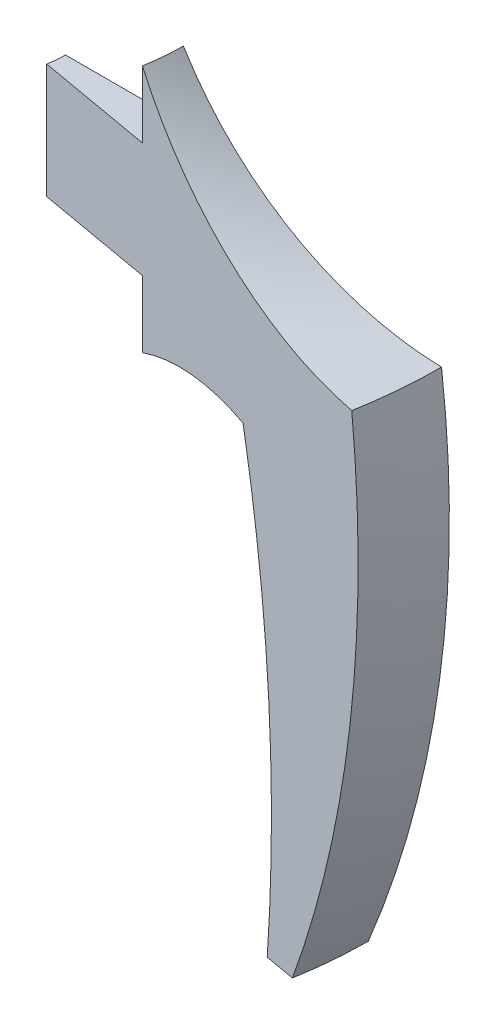
ISO-10303-21;
HEADER;
FILE_DESCRIPTION(('STEP AP214'),'2;1');
FILE_NAME('part.step','',(''),(''),'','','');
FILE_SCHEMA(('AUTOMOTIVE_DESIGN { 1 0 10303 214 1 1 1 1 }'));
ENDSEC;
DATA;
#1=APPLICATION_CONTEXT('core data for automotive mechanical design processes');
#2=APPLICATION_PROTOCOL_DEFINITION('international standard','automotive_design',2000,#1);
#3=PRODUCT_CONTEXT('',#1,'mechanical');
#4=PRODUCT('Part','Part','',(#3));
#5=PRODUCT_RELATED_PRODUCT_CATEGORY('part','',(#4));
#6=PRODUCT_DEFINITION_FORMATION('','',#4);
#7=PRODUCT_DEFINITION_CONTEXT('part definition',#1,'design');
#8=PRODUCT_DEFINITION('design','',#6,#7);
#9=PRODUCT_DEFINITION_SHAPE('','',#8);
#10=(LENGTH_UNIT() NAMED_UNIT(*) SI_UNIT(.MILLI.,.METRE.));
#11=(NAMED_UNIT(*) PLANE_ANGLE_UNIT() SI_UNIT($,.RADIAN.));
#12=(NAMED_UNIT(*) SI_UNIT($,.STERADIAN.) SOLID_ANGLE_UNIT());
#13=UNCERTAINTY_MEASURE_WITH_UNIT(LENGTH_MEASURE(1.E-05),#10,'distance_accuracy_value','');
#14=(GEOMETRIC_REPRESENTATION_CONTEXT(3) GLOBAL_UNCERTAINTY_ASSIGNED_CONTEXT((#13)) GLOBAL_UNIT_ASSIGNED_CONTEXT((#10,
#11,#12)) REPRESENTATION_CONTEXT('',''));
#15=CARTESIAN_POINT('',(0.,0.,0.));
#16=DIRECTION('',(0.,0.,1.));
#17=DIRECTION('',(1.,0.,0.));
#18=AXIS2_PLACEMENT_3D('',#15,#16,#17);
#19=CARTESIAN_POINT('',(0.,-47.2882717255415,0.));
#20=DIRECTION('',(0.,1.,0.));
#21=DIRECTION('',(0.,0.,1.));
#22=AXIS2_PLACEMENT_3D('',#19,#20,#21);
#23=TOROIDAL_SURFACE('',#22,47.4639570856553,30.0000000000007);
#24=CARTESIAN_POINT('',(0.,-18.2502267294816,0.));
#25=DIRECTION('',(0.,1.,0.));
#26=DIRECTION('',(0.,0.,1.));
#27=AXIS2_PLACEMENT_3D('',#24,#25,#26);
#28=CIRCLE('',#27,55.);
#29=CARTESIAN_POINT('',(54.1644264156714,-18.2502267294816,9.55064977168119));
#30=VERTEX_POINT('',#29);
#31=CARTESIAN_POINT('',(55.,-18.2502267294816,0.));
#32=VERTEX_POINT('',#31);
#33=EDGE_CURVE('E11',#30,#32,#28,.T.);
#34=ORIENTED_EDGE('',*,*,#33,.F.);
#35=CARTESIAN_POINT('',(46.7428729265921,-47.2882717255415,8.24202965278545));
#36=DIRECTION('',(-0.173648177666931,0.,0.984807753012208));
#37=DIRECTION('',(0.984807753012208,0.,0.173648177666931));
#38=AXIS2_PLACEMENT_3D('',#35,#36,#37);
#39=CIRCLE('',#38,30.0000000000007);
#40=CARTESIAN_POINT('',(34.4682713554273,-20.,6.07768621834258));
#41=VERTEX_POINT('',#40);
#42=EDGE_CURVE('E151',#30,#41,#39,.T.);
#43=ORIENTED_EDGE('',*,*,#42,.T.);
#44=CARTESIAN_POINT('',(0.,-20.,0.));
#45=DIRECTION('',(0.,1.,0.));
#46=DIRECTION('',(0.,0.,1.));
#47=AXIS2_PLACEMENT_3D('',#44,#45,#46);
#48=CIRCLE('',#47,35.);
#49=CARTESIAN_POINT('',(35.,-20.,0.));
#50=VERTEX_POINT('',#49);
#51=EDGE_CURVE('E50',#41,#50,#48,.T.);
#52=ORIENTED_EDGE('',*,*,#51,.T.);
#53=CARTESIAN_POINT('',(47.4639570856553,-47.2882717255415,0.));
#54=DIRECTION('',(0.,0.,1.));
#55=DIRECTION('',(1.,0.,0.));
#56=AXIS2_PLACEMENT_3D('',#53,#54,#55);
#57=CIRCLE('',#56,30.0000000000007);
#58=EDGE_CURVE('E122',#32,#50,#57,.T.);
#59=ORIENTED_EDGE('',*,*,#58,.F.);
#60=EDGE_LOOP('',(#34,#43,#52,#59));
#61=FACE_BOUND('',#60,.T.);
#62=ADVANCED_FACE('F35',(#61),#23,.F.);
#63=CARTESIAN_POINT('',(0.,-69.9486829073735,0.));
#64=DIRECTION('',(0.,1.,0.));
#65=DIRECTION('',(0.,0.,1.));
#66=AXIS2_PLACEMENT_3D('',#63,#64,#65);
#67=DEGENERATE_TOROIDAL_SURFACE('',#66,179.36567502265,240.,.F.);
#68=CARTESIAN_POINT('',(0.,-89.9999999999954,0.));
#69=DIRECTION('',(0.,1.,0.));
#70=DIRECTION('',(0.,0.,1.));
#71=AXIS2_PLACEMENT_3D('',#68,#69,#70);
#72=CIRCLE('',#71,59.7952429444186);
#73=CARTESIAN_POINT('',(58.886818844912,-89.9999999999954,10.3833349704497));
#74=VERTEX_POINT('',#73);
#75=CARTESIAN_POINT('',(59.7952429444186,-89.9999999999954,0.));
#76=VERTEX_POINT('',#75);
#77=EDGE_CURVE('E43',#74,#76,#72,.T.);
#78=ORIENTED_EDGE('',*,*,#77,.F.);
#79=CARTESIAN_POINT('',(-176.640707386574,-69.9486829073735,-31.1465226036822));
#80=DIRECTION('',(-0.173648177666931,0.,0.984807753012208));
#81=DIRECTION('',(0.984807753012208,0.,0.173648177666931));
#82=AXIS2_PLACEMENT_3D('',#79,#80,#81);
#83=CIRCLE('',#82,240.);
#84=EDGE_CURVE('E118',#30,#74,#83,.F.);
#85=ORIENTED_EDGE('',*,*,#84,.F.);
#86=ORIENTED_EDGE('',*,*,#33,.T.);
#87=CARTESIAN_POINT('',(-179.36567502265,-69.9486829073735,0.));
#88=DIRECTION('',(0.,0.,1.));
#89=DIRECTION('',(1.,0.,0.));
#90=AXIS2_PLACEMENT_3D('',#87,#88,#89);
#91=CIRCLE('',#90,240.);
#92=EDGE_CURVE('E115',#32,#76,#91,.F.);
#93=ORIENTED_EDGE('',*,*,#92,.T.);
#94=EDGE_LOOP('',(#78,#85,#86,#93));
#95=FACE_BOUND('',#94,.T.);
#96=ADVANCED_FACE('F37',(#95),#67,.T.);
#97=CARTESIAN_POINT('',(2.4600515450028E-13,-89.9999999999954,0.));
#98=DIRECTION('',(0.,1.,0.));
#99=DIRECTION('',(0.,0.,1.));
#100=AXIS2_PLACEMENT_3D('',#97,#98,#99);
#101=PLANE('',#100);
#102=CARTESIAN_POINT('',(0.,-89.9999999999954,0.));
#103=DIRECTION('',(0.,1.,0.));
#104=DIRECTION('',(0.,0.,1.));
#105=AXIS2_PLACEMENT_3D('',#102,#103,#104);
#106=CIRCLE('',#105,64.7952429444186);
#107=CARTESIAN_POINT('',(63.810857609973,-89.9999999999954,11.2515758587843));
#108=VERTEX_POINT('',#107);
#109=CARTESIAN_POINT('',(64.7952429444186,-89.9999999999954,0.));
#110=VERTEX_POINT('',#109);
#111=EDGE_CURVE('E187',#108,#110,#106,.T.);
#112=ORIENTED_EDGE('',*,*,#111,.F.);
#113=DIRECTION('',(0.984807753012208,0.,0.173648177666931));
#114=VECTOR('',#113,1.);
#115=CARTESIAN_POINT('',(2.4600515450028E-13,-89.9999999999956,0.));
#116=LINE('',#115,#114);
#117=EDGE_CURVE('E154',#74,#108,#116,.T.);
#118=ORIENTED_EDGE('',*,*,#117,.F.);
#119=ORIENTED_EDGE('',*,*,#77,.T.);
#120=DIRECTION('',(1.,0.,0.));
#121=VECTOR('',#120,1.);
#122=CARTESIAN_POINT('',(2.49800180540648E-13,-89.9999999999956,0.));
#123=LINE('',#122,#121);
#124=EDGE_CURVE('E129',#76,#110,#123,.T.);
#125=ORIENTED_EDGE('',*,*,#124,.T.);
#126=EDGE_LOOP('',(#112,#118,#119,#125));
#127=FACE_BOUND('',#126,.T.);
#128=ADVANCED_FACE('F190',(#127),#101,.F.);
#129=CARTESIAN_POINT('',(0.,-24.6794126382788,0.));
#130=DIRECTION('',(0.,1.,0.));
#131=DIRECTION('',(0.,0.,1.));
#132=AXIS2_PLACEMENT_3D('',#129,#130,#131);
#133=DEGENERATE_TOROIDAL_SURFACE('',#132,92.1544969939462,170.,.F.);
#134=CARTESIAN_POINT('',(0.,-4.00859690889221,0.));
#135=DIRECTION('',(0.,1.,0.));
#136=DIRECTION('',(0.,0.,1.));
#137=AXIS2_PLACEMENT_3D('',#134,#135,#136);
#138=CIRCLE('',#137,76.584109664642);
#139=CARTESIAN_POINT('',(75.4206249552766,-4.00859690889221,13.2986910815095));
#140=VERTEX_POINT('',#139);
#141=CARTESIAN_POINT('',(76.584109664642,-4.00859690889221,0.));
#142=VERTEX_POINT('',#141);
#143=EDGE_CURVE('E185',#140,#142,#138,.T.);
#144=ORIENTED_EDGE('',*,*,#143,.F.);
#145=CARTESIAN_POINT('',(-90.7544631145785,-24.6794126382788,-16.0024604668114));
#146=DIRECTION('',(-0.173648177666931,0.,0.984807753012208));
#147=DIRECTION('',(0.984807753012208,0.,0.173648177666931));
#148=AXIS2_PLACEMENT_3D('',#145,#146,#147);
#149=CIRCLE('',#148,170.);
#150=EDGE_CURVE('E157',#140,#108,#149,.F.);
#151=ORIENTED_EDGE('',*,*,#150,.T.);
#152=ORIENTED_EDGE('',*,*,#111,.T.);
#153=CARTESIAN_POINT('',(-92.1544969939462,-24.6794126382788,0.));
#154=DIRECTION('',(0.,0.,1.));
#155=DIRECTION('',(1.,0.,0.));
#156=AXIS2_PLACEMENT_3D('',#153,#154,#155);
#157=CIRCLE('',#156,170.);
#158=EDGE_CURVE('E131',#142,#110,#157,.F.);
#159=ORIENTED_EDGE('',*,*,#158,.F.);
#160=EDGE_LOOP('',(#144,#151,#152,#159));
#161=FACE_BOUND('',#160,.T.);
#162=ADVANCED_FACE('F215',(#161),#133,.F.);
#163=CARTESIAN_POINT('',(0.,45.9784667930941,0.));
#164=DIRECTION('',(0.,1.,0.));
#165=DIRECTION('',(0.,0.,1.));
#166=AXIS2_PLACEMENT_3D('',#163,#164,#165);
#167=TOROIDAL_SURFACE('',#166,77.7214145725549,50.);
#168=CARTESIAN_POINT('',(0.,20.,0.));
#169=DIRECTION('',(0.,1.,0.));
#170=DIRECTION('',(0.,0.,1.));
#171=AXIS2_PLACEMENT_3D('',#168,#169,#170);
#172=CIRCLE('',#171,35.);
#173=CARTESIAN_POINT('',(34.4682713554273,20.,6.07768621834258));
#174=VERTEX_POINT('',#173);
#175=CARTESIAN_POINT('',(35.,20.,0.));
#176=VERTEX_POINT('',#175);
#177=EDGE_CURVE('E183',#174,#176,#172,.T.);
#178=ORIENTED_EDGE('',*,*,#177,.F.);
#179=CARTESIAN_POINT('',(76.5406516461281,45.9784667930941,13.4961820062202));
#180=DIRECTION('',(-0.173648177666931,0.,0.984807753012208));
#181=DIRECTION('',(0.984807753012208,0.,0.173648177666931));
#182=AXIS2_PLACEMENT_3D('',#179,#180,#181);
#183=CIRCLE('',#182,50.);
#184=EDGE_CURVE('E160',#174,#140,#183,.T.);
#185=ORIENTED_EDGE('',*,*,#184,.T.);
#186=ORIENTED_EDGE('',*,*,#143,.T.);
#187=CARTESIAN_POINT('',(77.7214145725549,45.9784667930941,0.));
#188=DIRECTION('',(0.,0.,1.));
#189=DIRECTION('',(1.,0.,0.));
#190=AXIS2_PLACEMENT_3D('',#187,#188,#189);
#191=CIRCLE('',#190,50.);
#192=EDGE_CURVE('E135',#176,#142,#191,.T.);
#193=ORIENTED_EDGE('',*,*,#192,.F.);
#194=EDGE_LOOP('',(#178,#185,#186,#193));
#195=FACE_BOUND('',#194,.T.);
#196=ADVANCED_FACE('F212',(#195),#167,.F.);
#197=CARTESIAN_POINT('',(0.,0.,0.));
#198=DIRECTION('',(0.,1.,0.));
#199=DIRECTION('',(0.,0.,1.));
#200=AXIS2_PLACEMENT_3D('',#197,#198,#199);
#201=CYLINDRICAL_SURFACE('',#200,35.);
#202=CARTESIAN_POINT('',(0.,9.25,0.));
#203=DIRECTION('',(0.,1.,0.));
#204=DIRECTION('',(0.,0.,1.));
#205=AXIS2_PLACEMENT_3D('',#202,#203,#204);
#206=CIRCLE('',#205,35.);
#207=CARTESIAN_POINT('',(34.4682713554273,9.25,6.07768621834258));
#208=VERTEX_POINT('',#207);
#209=CARTESIAN_POINT('',(35.,9.25,0.));
#210=VERTEX_POINT('',#209);
#211=EDGE_CURVE('E181',#208,#210,#206,.T.);
#212=ORIENTED_EDGE('',*,*,#211,.F.);
#213=DIRECTION('',(0.,1.,0.));
#214=VECTOR('',#213,1.);
#215=CARTESIAN_POINT('',(34.4682713554273,0.,6.07768621834258));
#216=LINE('',#215,#214);
#217=EDGE_CURVE('E163',#208,#174,#216,.T.);
#218=ORIENTED_EDGE('',*,*,#217,.T.);
#219=ORIENTED_EDGE('',*,*,#177,.T.);
#220=DIRECTION('',(0.,1.,0.));
#221=VECTOR('',#220,1.);
#222=CARTESIAN_POINT('',(35.,0.,0.));
#223=LINE('',#222,#221);
#224=EDGE_CURVE('E138',#210,#176,#223,.T.);
#225=ORIENTED_EDGE('',*,*,#224,.F.);
#226=EDGE_LOOP('',(#212,#218,#219,#225));
#227=FACE_BOUND('',#226,.T.);
#228=ADVANCED_FACE('F208',(#227),#201,.F.);
#229=CARTESIAN_POINT('',(0.,9.25,0.));
#230=DIRECTION('',(0.,1.,0.));
#231=DIRECTION('',(0.,0.,1.));
#232=AXIS2_PLACEMENT_3D('',#229,#230,#231);
#233=PLANE('',#232);
#234=CARTESIAN_POINT('',(0.,9.25,0.));
#235=DIRECTION('',(0.,1.,0.));
#236=DIRECTION('',(0.,0.,1.));
#237=AXIS2_PLACEMENT_3D('',#234,#235,#236);
#238=CIRCLE('',#237,16.);
#239=CARTESIAN_POINT('',(15.7569240481953,9.25,2.77837084267089));
#240=VERTEX_POINT('',#239);
#241=CARTESIAN_POINT('',(16.,9.25,0.));
#242=VERTEX_POINT('',#241);
#243=EDGE_CURVE('E179',#240,#242,#238,.T.);
#244=ORIENTED_EDGE('',*,*,#243,.F.);
#245=DIRECTION('',(0.984807753012208,0.,0.173648177666931));
#246=VECTOR('',#245,1.);
#247=CARTESIAN_POINT('',(0.,9.25,0.));
#248=LINE('',#247,#246);
#249=EDGE_CURVE('E166',#240,#208,#248,.T.);
#250=ORIENTED_EDGE('',*,*,#249,.T.);
#251=ORIENTED_EDGE('',*,*,#211,.T.);
#252=DIRECTION('',(1.,0.,0.));
#253=VECTOR('',#252,1.);
#254=CARTESIAN_POINT('',(0.,9.25,0.));
#255=LINE('',#254,#253);
#256=EDGE_CURVE('E141',#242,#210,#255,.T.);
#257=ORIENTED_EDGE('',*,*,#256,.F.);
#258=EDGE_LOOP('',(#244,#250,#251,#257));
#259=FACE_BOUND('',#258,.T.);
#260=ADVANCED_FACE('F204',(#259),#233,.T.);
#261=CARTESIAN_POINT('',(0.,0.,0.));
#262=DIRECTION('',(0.,1.,0.));
#263=DIRECTION('',(0.,0.,1.));
#264=AXIS2_PLACEMENT_3D('',#261,#262,#263);
#265=CYLINDRICAL_SURFACE('',#264,16.);
#266=CARTESIAN_POINT('',(0.,-9.25,0.));
#267=DIRECTION('',(0.,1.,0.));
#268=DIRECTION('',(0.,0.,1.));
#269=AXIS2_PLACEMENT_3D('',#266,#267,#268);
#270=CIRCLE('',#269,16.);
#271=CARTESIAN_POINT('',(15.7569240481953,-9.25,2.77837084267089));
#272=VERTEX_POINT('',#271);
#273=CARTESIAN_POINT('',(16.,-9.25,0.));
#274=VERTEX_POINT('',#273);
#275=EDGE_CURVE('E177',#272,#274,#270,.T.);
#276=ORIENTED_EDGE('',*,*,#275,.F.);
#277=DIRECTION('',(0.,1.,0.));
#278=VECTOR('',#277,1.);
#279=CARTESIAN_POINT('',(15.7569240481953,0.,2.77837084267089));
#280=LINE('',#279,#278);
#281=EDGE_CURVE('E170',#272,#240,#280,.T.);
#282=ORIENTED_EDGE('',*,*,#281,.T.);
#283=ORIENTED_EDGE('',*,*,#243,.T.);
#284=DIRECTION('',(0.,1.,0.));
#285=VECTOR('',#284,1.);
#286=CARTESIAN_POINT('',(16.,0.,0.));
#287=LINE('',#286,#285);
#288=EDGE_CURVE('E145',#274,#242,#287,.T.);
#289=ORIENTED_EDGE('',*,*,#288,.F.);
#290=EDGE_LOOP('',(#276,#282,#283,#289));
#291=FACE_BOUND('',#290,.T.);
#292=ADVANCED_FACE('F201',(#291),#265,.F.);
#293=CARTESIAN_POINT('',(0.,-9.25,0.));
#294=DIRECTION('',(0.,-1.,0.));
#295=DIRECTION('',(0.,0.,-1.));
#296=AXIS2_PLACEMENT_3D('',#293,#294,#295);
#297=PLANE('',#296);
#298=CARTESIAN_POINT('',(0.,-9.25,0.));
#299=DIRECTION('',(0.,1.,0.));
#300=DIRECTION('',(0.,0.,1.));
#301=AXIS2_PLACEMENT_3D('',#298,#299,#300);
#302=CIRCLE('',#301,35.);
#303=CARTESIAN_POINT('',(34.4682713554273,-9.25,6.07768621834258));
#304=VERTEX_POINT('',#303);
#305=CARTESIAN_POINT('',(35.,-9.25,0.));
#306=VERTEX_POINT('',#305);
#307=EDGE_CURVE('E58',#304,#306,#302,.T.);
#308=ORIENTED_EDGE('',*,*,#307,.F.);
#309=DIRECTION('',(-0.984807753012208,0.,-0.173648177666931));
#310=VECTOR('',#309,1.);
#311=CARTESIAN_POINT('',(0.,-9.25,0.));
#312=LINE('',#311,#310);
#313=EDGE_CURVE('E173',#304,#272,#312,.T.);
#314=ORIENTED_EDGE('',*,*,#313,.T.);
#315=ORIENTED_EDGE('',*,*,#275,.T.);
#316=DIRECTION('',(-1.,0.,0.));
#317=VECTOR('',#316,1.);
#318=CARTESIAN_POINT('',(0.,-9.25,0.));
#319=LINE('',#318,#317);
#320=EDGE_CURVE('E148',#306,#274,#319,.T.);
#321=ORIENTED_EDGE('',*,*,#320,.F.);
#322=EDGE_LOOP('',(#308,#314,#315,#321));
#323=FACE_BOUND('',#322,.T.);
#324=ADVANCED_FACE('F197',(#323),#297,.T.);
#325=EDGE_CURVE('E167',#41,#304,#216,.T.);
#326=ORIENTED_EDGE('',*,*,#325,.T.);
#327=ORIENTED_EDGE('',*,*,#307,.T.);
#328=EDGE_CURVE('E142',#50,#306,#223,.T.);
#329=ORIENTED_EDGE('',*,*,#328,.F.);
#330=ORIENTED_EDGE('',*,*,#51,.F.);
#331=EDGE_LOOP('',(#326,#327,#329,#330));
#332=FACE_BOUND('',#331,.T.);
#333=ADVANCED_FACE('F196',(#332),#201,.F.);
#334=CARTESIAN_POINT('',(0.,0.,0.));
#335=DIRECTION('',(-0.173648177666931,0.,0.984807753012208));
#336=DIRECTION('',(0.984807753012208,0.,0.173648177666931));
#337=AXIS2_PLACEMENT_3D('',#334,#335,#336);
#338=PLANE('',#337);
#339=ORIENTED_EDGE('',*,*,#42,.F.);
#340=ORIENTED_EDGE('',*,*,#84,.T.);
#341=ORIENTED_EDGE('',*,*,#117,.T.);
#342=ORIENTED_EDGE('',*,*,#150,.F.);
#343=ORIENTED_EDGE('',*,*,#184,.F.);
#344=ORIENTED_EDGE('',*,*,#217,.F.);
#345=ORIENTED_EDGE('',*,*,#249,.F.);
#346=ORIENTED_EDGE('',*,*,#281,.F.);
#347=ORIENTED_EDGE('',*,*,#313,.F.);
#348=ORIENTED_EDGE('',*,*,#325,.F.);
#349=EDGE_LOOP('',(#339,#340,#341,#342,#343,#344,#345,#346,#347,#348));
#350=FACE_BOUND('',#349,.T.);
#351=ADVANCED_FACE('F192',(#350),#338,.T.);
#352=CARTESIAN_POINT('',(0.,0.,0.));
#353=DIRECTION('',(0.,0.,1.));
#354=DIRECTION('',(1.,0.,0.));
#355=AXIS2_PLACEMENT_3D('',#352,#353,#354);
#356=PLANE('',#355);
#357=ORIENTED_EDGE('',*,*,#58,.T.);
#358=ORIENTED_EDGE('',*,*,#328,.T.);
#359=ORIENTED_EDGE('',*,*,#320,.T.);
#360=ORIENTED_EDGE('',*,*,#288,.T.);
#361=ORIENTED_EDGE('',*,*,#256,.T.);
#362=ORIENTED_EDGE('',*,*,#224,.T.);
#363=ORIENTED_EDGE('',*,*,#192,.T.);
#364=ORIENTED_EDGE('',*,*,#158,.T.);
#365=ORIENTED_EDGE('',*,*,#124,.F.);
#366=ORIENTED_EDGE('',*,*,#92,.F.);
#367=EDGE_LOOP('',(#357,#358,#359,#360,#361,#362,#363,#364,#365,#366));
#368=FACE_BOUND('',#367,.T.);
#369=ADVANCED_FACE('F126',(#368),#356,.F.);
#370=CLOSED_SHELL('',(#62,#96,#128,#162,#196,#228,#260,#292,#324,#333,#351,#369));
#371=MANIFOLD_SOLID_BREP('B2',#370);
#372=ADVANCED_BREP_SHAPE_REPRESENTATION('',(#18,#371),#14);
#373=SHAPE_DEFINITION_REPRESENTATION(#9,#372);
ENDSEC;
END-ISO-10303-21;
